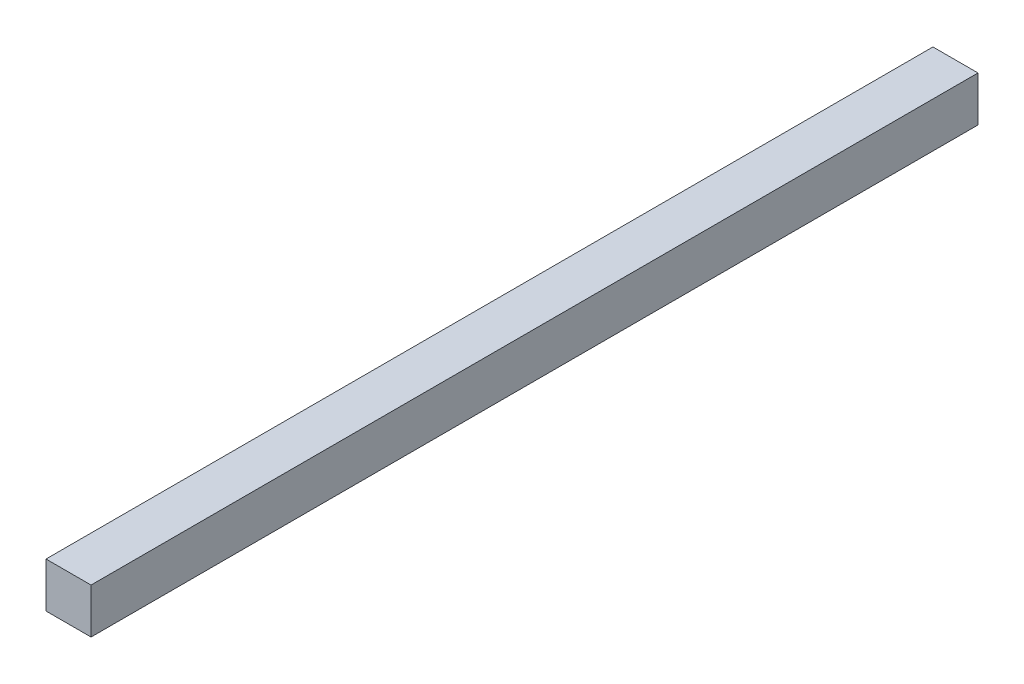
ISO-10303-21;
HEADER;
FILE_DESCRIPTION(('STEP AP214'),'2;1');
FILE_NAME('part.step','',(''),(''),'','','');
FILE_SCHEMA(('AUTOMOTIVE_DESIGN { 1 0 10303 214 1 1 1 1 }'));
ENDSEC;
DATA;
#1=APPLICATION_CONTEXT('core data for automotive mechanical design processes');
#2=APPLICATION_PROTOCOL_DEFINITION('international standard','automotive_design',2000,#1);
#3=PRODUCT_CONTEXT('',#1,'mechanical');
#4=PRODUCT('Part','Part','',(#3));
#5=PRODUCT_RELATED_PRODUCT_CATEGORY('part','',(#4));
#6=PRODUCT_DEFINITION_FORMATION('','',#4);
#7=PRODUCT_DEFINITION_CONTEXT('part definition',#1,'design');
#8=PRODUCT_DEFINITION('design','',#6,#7);
#9=PRODUCT_DEFINITION_SHAPE('','',#8);
#10=(LENGTH_UNIT() NAMED_UNIT(*) SI_UNIT(.MILLI.,.METRE.));
#11=(NAMED_UNIT(*) PLANE_ANGLE_UNIT() SI_UNIT($,.RADIAN.));
#12=(NAMED_UNIT(*) SI_UNIT($,.STERADIAN.) SOLID_ANGLE_UNIT());
#13=UNCERTAINTY_MEASURE_WITH_UNIT(LENGTH_MEASURE(1.E-05),#10,'distance_accuracy_value','');
#14=(GEOMETRIC_REPRESENTATION_CONTEXT(3) GLOBAL_UNCERTAINTY_ASSIGNED_CONTEXT((#13)) GLOBAL_UNIT_ASSIGNED_CONTEXT((#10,
#11,#12)) REPRESENTATION_CONTEXT('',''));
#15=CARTESIAN_POINT('',(0.,0.,0.));
#16=DIRECTION('',(0.,0.,1.));
#17=DIRECTION('',(1.,0.,0.));
#18=AXIS2_PLACEMENT_3D('',#15,#16,#17);
#19=CARTESIAN_POINT('',(0.2667,-0.2667,0.));
#20=DIRECTION('',(-1.,0.,0.));
#21=DIRECTION('',(0.,0.,1.));
#22=AXIS2_PLACEMENT_3D('',#19,#20,#21);
#23=PLANE('',#22);
#24=DIRECTION('',(0.,0.,-1.));
#25=VECTOR('',#24,1.);
#26=CARTESIAN_POINT('',(0.2667,0.2667,0.));
#27=LINE('',#26,#25);
#28=CARTESIAN_POINT('',(0.2667,0.2667,10.5));
#29=VERTEX_POINT('',#28);
#30=CARTESIAN_POINT('',(0.2667,0.2667,0.));
#31=VERTEX_POINT('',#30);
#32=EDGE_CURVE('E128',#29,#31,#27,.T.);
#33=ORIENTED_EDGE('',*,*,#32,.F.);
#34=DIRECTION('',(0.,1.,0.));
#35=VECTOR('',#34,1.);
#36=CARTESIAN_POINT('',(0.2667,-0.2667,10.5));
#37=LINE('',#36,#35);
#38=CARTESIAN_POINT('',(0.2667,-0.2667,10.5));
#39=VERTEX_POINT('',#38);
#40=EDGE_CURVE('E116',#39,#29,#37,.T.);
#41=ORIENTED_EDGE('',*,*,#40,.F.);
#42=DIRECTION('',(0.,0.,1.));
#43=VECTOR('',#42,1.);
#44=CARTESIAN_POINT('',(0.2667,-0.2667,0.));
#45=LINE('',#44,#43);
#46=CARTESIAN_POINT('',(0.2667,-0.2667,0.));
#47=VERTEX_POINT('',#46);
#48=EDGE_CURVE('E87',#47,#39,#45,.T.);
#49=ORIENTED_EDGE('',*,*,#48,.F.);
#50=DIRECTION('',(0.,-1.,0.));
#51=VECTOR('',#50,1.);
#52=CARTESIAN_POINT('',(0.2667,-0.2667,0.));
#53=LINE('',#52,#51);
#54=EDGE_CURVE('E11',#31,#47,#53,.T.);
#55=ORIENTED_EDGE('',*,*,#54,.F.);
#56=EDGE_LOOP('',(#33,#41,#49,#55));
#57=FACE_BOUND('',#56,.T.);
#58=ADVANCED_FACE('F16',(#57),#23,.F.);
#59=CARTESIAN_POINT('',(0.2667,-0.2667,0.));
#60=DIRECTION('',(0.,0.,-1.));
#61=DIRECTION('',(0.,-1.,0.));
#62=AXIS2_PLACEMENT_3D('',#59,#60,#61);
#63=PLANE('',#62);
#64=DIRECTION('',(1.,0.,0.));
#65=VECTOR('',#64,1.);
#66=CARTESIAN_POINT('',(0.2667,0.2667,0.));
#67=LINE('',#66,#65);
#68=CARTESIAN_POINT('',(-0.2667,0.2667,0.));
#69=VERTEX_POINT('',#68);
#70=EDGE_CURVE('E27',#69,#31,#67,.T.);
#71=ORIENTED_EDGE('',*,*,#70,.T.);
#72=ORIENTED_EDGE('',*,*,#54,.T.);
#73=DIRECTION('',(-1.,0.,0.));
#74=VECTOR('',#73,1.);
#75=CARTESIAN_POINT('',(0.2667,-0.2667,0.));
#76=LINE('',#75,#74);
#77=CARTESIAN_POINT('',(-0.2667,-0.2667,0.));
#78=VERTEX_POINT('',#77);
#79=EDGE_CURVE('E72',#47,#78,#76,.T.);
#80=ORIENTED_EDGE('',*,*,#79,.T.);
#81=DIRECTION('',(0.,1.,0.));
#82=VECTOR('',#81,1.);
#83=CARTESIAN_POINT('',(-0.2667,0.2667,0.));
#84=LINE('',#83,#82);
#85=EDGE_CURVE('E75',#78,#69,#84,.T.);
#86=ORIENTED_EDGE('',*,*,#85,.T.);
#87=EDGE_LOOP('',(#71,#72,#80,#86));
#88=FACE_BOUND('',#87,.T.);
#89=ADVANCED_FACE('F74',(#88),#63,.T.);
#90=CARTESIAN_POINT('',(0.2667,0.2667,0.));
#91=DIRECTION('',(0.,-1.,0.));
#92=DIRECTION('',(0.,0.,-1.));
#93=AXIS2_PLACEMENT_3D('',#90,#91,#92);
#94=PLANE('',#93);
#95=DIRECTION('',(0.,0.,-1.));
#96=VECTOR('',#95,1.);
#97=CARTESIAN_POINT('',(-0.2667,0.2667,0.));
#98=LINE('',#97,#96);
#99=CARTESIAN_POINT('',(-0.2667,0.2667,10.5));
#100=VERTEX_POINT('',#99);
#101=EDGE_CURVE('E85',#100,#69,#98,.T.);
#102=ORIENTED_EDGE('',*,*,#101,.F.);
#103=DIRECTION('',(-1.,0.,0.));
#104=VECTOR('',#103,1.);
#105=CARTESIAN_POINT('',(0.2667,0.2667,10.5));
#106=LINE('',#105,#104);
#107=EDGE_CURVE('E20',#29,#100,#106,.T.);
#108=ORIENTED_EDGE('',*,*,#107,.F.);
#109=ORIENTED_EDGE('',*,*,#32,.T.);
#110=ORIENTED_EDGE('',*,*,#70,.F.);
#111=EDGE_LOOP('',(#102,#108,#109,#110));
#112=FACE_BOUND('',#111,.T.);
#113=ADVANCED_FACE('F18',(#112),#94,.F.);
#114=CARTESIAN_POINT('',(0.2667,-0.2667,10.5));
#115=DIRECTION('',(0.,0.,-1.));
#116=DIRECTION('',(0.,-1.,0.));
#117=AXIS2_PLACEMENT_3D('',#114,#115,#116);
#118=PLANE('',#117);
#119=ORIENTED_EDGE('',*,*,#107,.T.);
#120=DIRECTION('',(0.,1.,0.));
#121=VECTOR('',#120,1.);
#122=CARTESIAN_POINT('',(-0.2667,-0.2667,10.5));
#123=LINE('',#122,#121);
#124=CARTESIAN_POINT('',(-0.2667,-0.2667,10.5));
#125=VERTEX_POINT('',#124);
#126=EDGE_CURVE('E91',#125,#100,#123,.T.);
#127=ORIENTED_EDGE('',*,*,#126,.F.);
#128=DIRECTION('',(-1.,0.,0.));
#129=VECTOR('',#128,1.);
#130=CARTESIAN_POINT('',(0.2667,-0.2667,10.5));
#131=LINE('',#130,#129);
#132=EDGE_CURVE('E63',#39,#125,#131,.T.);
#133=ORIENTED_EDGE('',*,*,#132,.F.);
#134=ORIENTED_EDGE('',*,*,#40,.T.);
#135=EDGE_LOOP('',(#119,#127,#133,#134));
#136=FACE_BOUND('',#135,.T.);
#137=ADVANCED_FACE('F155',(#136),#118,.F.);
#138=CARTESIAN_POINT('',(-0.2667,-0.2667,0.));
#139=DIRECTION('',(0.,1.,0.));
#140=DIRECTION('',(1.,0.,0.));
#141=AXIS2_PLACEMENT_3D('',#138,#139,#140);
#142=PLANE('',#141);
#143=ORIENTED_EDGE('',*,*,#48,.T.);
#144=ORIENTED_EDGE('',*,*,#132,.T.);
#145=DIRECTION('',(0.,0.,1.));
#146=VECTOR('',#145,1.);
#147=CARTESIAN_POINT('',(-0.2667,-0.2667,0.));
#148=LINE('',#147,#146);
#149=EDGE_CURVE('E83',#78,#125,#148,.T.);
#150=ORIENTED_EDGE('',*,*,#149,.F.);
#151=ORIENTED_EDGE('',*,*,#79,.F.);
#152=EDGE_LOOP('',(#143,#144,#150,#151));
#153=FACE_BOUND('',#152,.T.);
#154=ADVANCED_FACE('F89',(#153),#142,.F.);
#155=CARTESIAN_POINT('',(-0.2667,0.2667,0.));
#156=DIRECTION('',(1.,0.,0.));
#157=DIRECTION('',(0.,1.,0.));
#158=AXIS2_PLACEMENT_3D('',#155,#156,#157);
#159=PLANE('',#158);
#160=ORIENTED_EDGE('',*,*,#149,.T.);
#161=ORIENTED_EDGE('',*,*,#126,.T.);
#162=ORIENTED_EDGE('',*,*,#101,.T.);
#163=ORIENTED_EDGE('',*,*,#85,.F.);
#164=EDGE_LOOP('',(#160,#161,#162,#163));
#165=FACE_BOUND('',#164,.T.);
#166=ADVANCED_FACE('F81',(#165),#159,.F.);
#167=CLOSED_SHELL('',(#58,#89,#113,#137,#154,#166));
#168=MANIFOLD_SOLID_BREP('B1',#167);
#169=ADVANCED_BREP_SHAPE_REPRESENTATION('',(#18,#168),#14);
#170=SHAPE_DEFINITION_REPRESENTATION(#9,#169);
ENDSEC;
END-ISO-10303-21;
